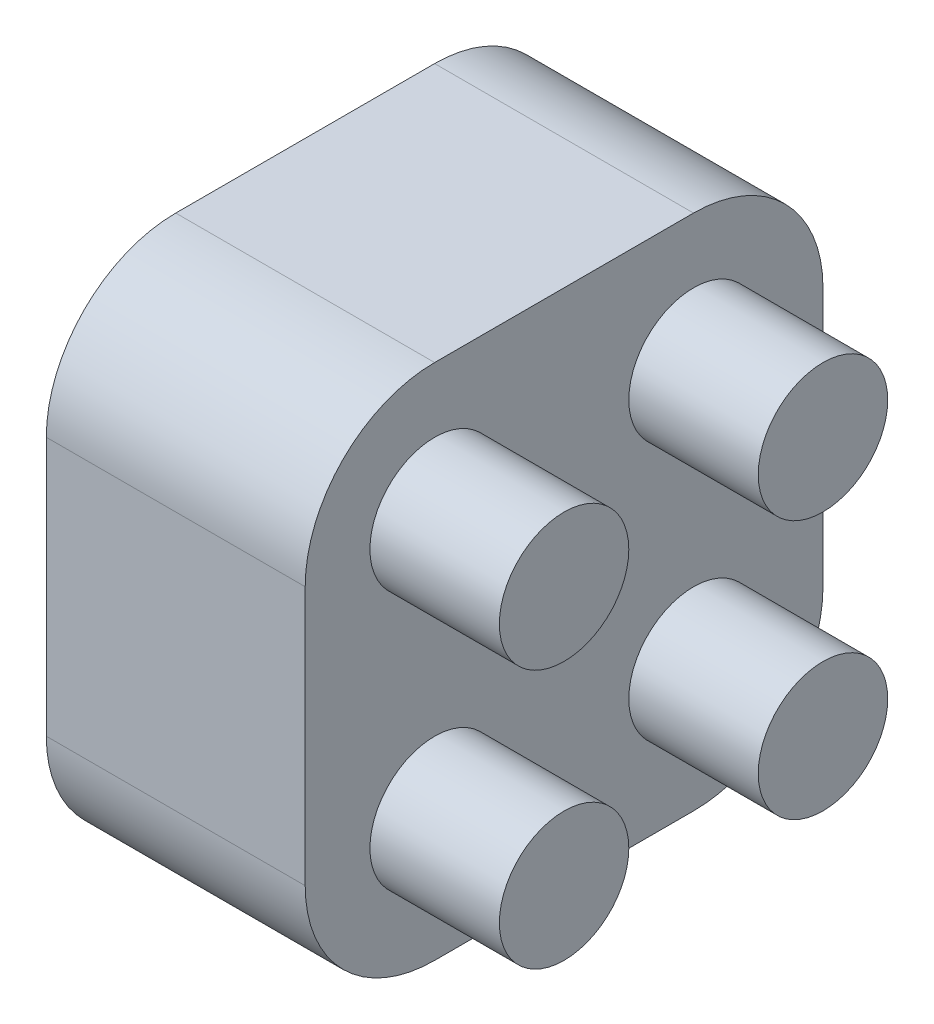
ISO-10303-21;
HEADER;
FILE_DESCRIPTION(('STEP AP214'),'2;1');
FILE_NAME('part.step','',(''),(''),'','','');
FILE_SCHEMA(('AUTOMOTIVE_DESIGN { 1 0 10303 214 1 1 1 1 }'));
ENDSEC;
DATA;
#1=APPLICATION_CONTEXT('core data for automotive mechanical design processes');
#2=APPLICATION_PROTOCOL_DEFINITION('international standard','automotive_design',2000,#1);
#3=PRODUCT_CONTEXT('',#1,'mechanical');
#4=PRODUCT('Part','Part','',(#3));
#5=PRODUCT_RELATED_PRODUCT_CATEGORY('part','',(#4));
#6=PRODUCT_DEFINITION_FORMATION('','',#4);
#7=PRODUCT_DEFINITION_CONTEXT('part definition',#1,'design');
#8=PRODUCT_DEFINITION('design','',#6,#7);
#9=PRODUCT_DEFINITION_SHAPE('','',#8);
#10=(LENGTH_UNIT() NAMED_UNIT(*) SI_UNIT(.MILLI.,.METRE.));
#11=(NAMED_UNIT(*) PLANE_ANGLE_UNIT() SI_UNIT($,.RADIAN.));
#12=(NAMED_UNIT(*) SI_UNIT($,.STERADIAN.) SOLID_ANGLE_UNIT());
#13=UNCERTAINTY_MEASURE_WITH_UNIT(LENGTH_MEASURE(1.E-05),#10,'distance_accuracy_value','');
#14=(GEOMETRIC_REPRESENTATION_CONTEXT(3) GLOBAL_UNCERTAINTY_ASSIGNED_CONTEXT((#13)) GLOBAL_UNIT_ASSIGNED_CONTEXT((#10,
#11,#12)) REPRESENTATION_CONTEXT('',''));
#15=CARTESIAN_POINT('',(0.,0.,0.));
#16=DIRECTION('',(0.,0.,1.));
#17=DIRECTION('',(1.,0.,0.));
#18=AXIS2_PLACEMENT_3D('',#15,#16,#17);
#19=CARTESIAN_POINT('',(0.,0.,0.));
#20=DIRECTION('',(-1.,0.,0.));
#21=DIRECTION('',(0.,0.,1.));
#22=AXIS2_PLACEMENT_3D('',#19,#20,#21);
#23=PLANE('',#22);
#24=DIRECTION('',(0.,1.,0.));
#25=VECTOR('',#24,1.);
#26=CARTESIAN_POINT('',(0.,0.,-20.));
#27=LINE('',#26,#25);
#28=CARTESIAN_POINT('',(0.,5.,-20.));
#29=VERTEX_POINT('',#28);
#30=CARTESIAN_POINT('',(0.,15.,-20.));
#31=VERTEX_POINT('',#30);
#32=EDGE_CURVE('E250',#29,#31,#27,.T.);
#33=ORIENTED_EDGE('',*,*,#32,.F.);
#34=CARTESIAN_POINT('',(0.,5.,-15.));
#35=DIRECTION('',(-1.,0.,0.));
#36=DIRECTION('',(0.,0.,1.));
#37=AXIS2_PLACEMENT_3D('',#34,#35,#36);
#38=CIRCLE('',#37,5.);
#39=CARTESIAN_POINT('',(0.,0.,-15.));
#40=VERTEX_POINT('',#39);
#41=EDGE_CURVE('E276',#29,#40,#38,.T.);
#42=ORIENTED_EDGE('',*,*,#41,.T.);
#43=DIRECTION('',(0.,0.,-1.));
#44=VECTOR('',#43,1.);
#45=CARTESIAN_POINT('',(0.,0.,0.));
#46=LINE('',#45,#44);
#47=CARTESIAN_POINT('',(0.,0.,-5.));
#48=VERTEX_POINT('',#47);
#49=EDGE_CURVE('E247',#48,#40,#46,.T.);
#50=ORIENTED_EDGE('',*,*,#49,.F.);
#51=CARTESIAN_POINT('',(0.,5.,-5.));
#52=DIRECTION('',(-1.,0.,0.));
#53=DIRECTION('',(0.,0.,1.));
#54=AXIS2_PLACEMENT_3D('',#51,#52,#53);
#55=CIRCLE('',#54,5.);
#56=CARTESIAN_POINT('',(0.,5.,0.));
#57=VERTEX_POINT('',#56);
#58=EDGE_CURVE('E274',#48,#57,#55,.T.);
#59=ORIENTED_EDGE('',*,*,#58,.T.);
#60=DIRECTION('',(0.,-1.,0.));
#61=VECTOR('',#60,1.);
#62=CARTESIAN_POINT('',(0.,0.,0.));
#63=LINE('',#62,#61);
#64=CARTESIAN_POINT('',(0.,15.,0.));
#65=VERTEX_POINT('',#64);
#66=EDGE_CURVE('E231',#65,#57,#63,.T.);
#67=ORIENTED_EDGE('',*,*,#66,.F.);
#68=CARTESIAN_POINT('',(0.,15.,-5.));
#69=DIRECTION('',(-1.,0.,0.));
#70=DIRECTION('',(0.,0.,1.));
#71=AXIS2_PLACEMENT_3D('',#68,#69,#70);
#72=CIRCLE('',#71,5.);
#73=CARTESIAN_POINT('',(0.,20.,-5.));
#74=VERTEX_POINT('',#73);
#75=EDGE_CURVE('E272',#65,#74,#72,.T.);
#76=ORIENTED_EDGE('',*,*,#75,.T.);
#77=DIRECTION('',(0.,0.,1.));
#78=VECTOR('',#77,1.);
#79=CARTESIAN_POINT('',(0.,20.,0.));
#80=LINE('',#79,#78);
#81=CARTESIAN_POINT('',(0.,20.,-15.));
#82=VERTEX_POINT('',#81);
#83=EDGE_CURVE('E236',#82,#74,#80,.T.);
#84=ORIENTED_EDGE('',*,*,#83,.F.);
#85=CARTESIAN_POINT('',(0.,15.,-15.));
#86=DIRECTION('',(-1.,0.,0.));
#87=DIRECTION('',(0.,0.,1.));
#88=AXIS2_PLACEMENT_3D('',#85,#86,#87);
#89=CIRCLE('',#88,5.);
#90=EDGE_CURVE('E270',#82,#31,#89,.T.);
#91=ORIENTED_EDGE('',*,*,#90,.T.);
#92=EDGE_LOOP('',(#33,#42,#50,#59,#67,#76,#84,#91));
#93=FACE_BOUND('',#92,.T.);
#94=CARTESIAN_POINT('',(0.,5.,-15.));
#95=DIRECTION('',(-1.,0.,0.));
#96=DIRECTION('',(0.,0.,1.));
#97=AXIS2_PLACEMENT_3D('',#94,#95,#96);
#98=CIRCLE('',#97,3.);
#99=CARTESIAN_POINT('',(0.,5.,-18.));
#100=VERTEX_POINT('',#99);
#101=CARTESIAN_POINT('',(0.,2.,-15.));
#102=VERTEX_POINT('',#101);
#103=EDGE_CURVE('E214',#100,#102,#98,.T.);
#104=ORIENTED_EDGE('',*,*,#103,.F.);
#105=DIRECTION('',(0.,1.,0.));
#106=VECTOR('',#105,1.);
#107=CARTESIAN_POINT('',(0.,0.,-18.));
#108=LINE('',#107,#106);
#109=CARTESIAN_POINT('',(0.,15.,-18.));
#110=VERTEX_POINT('',#109);
#111=EDGE_CURVE('E175',#100,#110,#108,.T.);
#112=ORIENTED_EDGE('',*,*,#111,.T.);
#113=CARTESIAN_POINT('',(0.,15.,-15.));
#114=DIRECTION('',(-1.,0.,0.));
#115=DIRECTION('',(0.,0.,1.));
#116=AXIS2_PLACEMENT_3D('',#113,#114,#115);
#117=CIRCLE('',#116,3.);
#118=CARTESIAN_POINT('',(0.,18.,-15.));
#119=VERTEX_POINT('',#118);
#120=EDGE_CURVE('E177',#119,#110,#117,.T.);
#121=ORIENTED_EDGE('',*,*,#120,.F.);
#122=DIRECTION('',(0.,0.,1.));
#123=VECTOR('',#122,1.);
#124=CARTESIAN_POINT('',(0.,18.,0.));
#125=LINE('',#124,#123);
#126=CARTESIAN_POINT('',(0.,18.,-5.));
#127=VERTEX_POINT('',#126);
#128=EDGE_CURVE('E48',#119,#127,#125,.T.);
#129=ORIENTED_EDGE('',*,*,#128,.T.);
#130=CARTESIAN_POINT('',(0.,15.,-5.));
#131=DIRECTION('',(-1.,0.,0.));
#132=DIRECTION('',(0.,0.,1.));
#133=AXIS2_PLACEMENT_3D('',#130,#131,#132);
#134=CIRCLE('',#133,3.);
#135=CARTESIAN_POINT('',(0.,15.,-2.));
#136=VERTEX_POINT('',#135);
#137=EDGE_CURVE('E180',#136,#127,#134,.T.);
#138=ORIENTED_EDGE('',*,*,#137,.F.);
#139=DIRECTION('',(0.,-1.,0.));
#140=VECTOR('',#139,1.);
#141=CARTESIAN_POINT('',(0.,0.,-2.));
#142=LINE('',#141,#140);
#143=CARTESIAN_POINT('',(0.,5.,-2.));
#144=VERTEX_POINT('',#143);
#145=EDGE_CURVE('E196',#136,#144,#142,.T.);
#146=ORIENTED_EDGE('',*,*,#145,.T.);
#147=CARTESIAN_POINT('',(0.,5.,-5.));
#148=DIRECTION('',(-1.,0.,0.));
#149=DIRECTION('',(0.,0.,1.));
#150=AXIS2_PLACEMENT_3D('',#147,#148,#149);
#151=CIRCLE('',#150,3.);
#152=CARTESIAN_POINT('',(0.,2.,-5.));
#153=VERTEX_POINT('',#152);
#154=EDGE_CURVE('E210',#153,#144,#151,.T.);
#155=ORIENTED_EDGE('',*,*,#154,.F.);
#156=DIRECTION('',(0.,0.,-1.));
#157=VECTOR('',#156,1.);
#158=CARTESIAN_POINT('',(0.,2.,0.));
#159=LINE('',#158,#157);
#160=EDGE_CURVE('E208',#153,#102,#159,.T.);
#161=ORIENTED_EDGE('',*,*,#160,.T.);
#162=EDGE_LOOP('',(#104,#112,#121,#129,#138,#146,#155,#161));
#163=FACE_BOUND('',#162,.T.);
#164=ADVANCED_FACE('F33',(#93,#163),#23,.T.);
#165=CARTESIAN_POINT('',(10.,0.,0.));
#166=DIRECTION('',(-1.,0.,0.));
#167=DIRECTION('',(0.,0.,1.));
#168=AXIS2_PLACEMENT_3D('',#165,#166,#167);
#169=PLANE('',#168);
#170=CARTESIAN_POINT('',(10.,5.,-15.0000000000001));
#171=DIRECTION('',(-1.,0.,0.));
#172=DIRECTION('',(0.,0.,1.));
#173=AXIS2_PLACEMENT_3D('',#170,#171,#172);
#174=CIRCLE('',#173,2.5);
#175=CARTESIAN_POINT('',(10.,5.,-12.5000000000001));
#176=VERTEX_POINT('',#175);
#177=EDGE_CURVE('E259',#176,#176,#174,.F.);
#178=ORIENTED_EDGE('',*,*,#177,.F.);
#179=EDGE_LOOP('',(#178));
#180=FACE_BOUND('',#179,.T.);
#181=CARTESIAN_POINT('',(10.,15.,-5.));
#182=DIRECTION('',(-1.,0.,0.));
#183=DIRECTION('',(0.,0.,1.));
#184=AXIS2_PLACEMENT_3D('',#181,#182,#183);
#185=CIRCLE('',#184,2.5);
#186=CARTESIAN_POINT('',(10.,15.,-2.5));
#187=VERTEX_POINT('',#186);
#188=EDGE_CURVE('E244',#187,#187,#185,.F.);
#189=ORIENTED_EDGE('',*,*,#188,.F.);
#190=EDGE_LOOP('',(#189));
#191=FACE_BOUND('',#190,.T.);
#192=DIRECTION('',(0.,0.,-1.));
#193=VECTOR('',#192,1.);
#194=CARTESIAN_POINT('',(10.,0.,0.));
#195=LINE('',#194,#193);
#196=CARTESIAN_POINT('',(10.,0.,-5.));
#197=VERTEX_POINT('',#196);
#198=CARTESIAN_POINT('',(10.,0.,-15.));
#199=VERTEX_POINT('',#198);
#200=EDGE_CURVE('E235',#197,#199,#195,.T.);
#201=ORIENTED_EDGE('',*,*,#200,.T.);
#202=CARTESIAN_POINT('',(10.,5.,-15.));
#203=DIRECTION('',(-1.,0.,0.));
#204=DIRECTION('',(0.,0.,1.));
#205=AXIS2_PLACEMENT_3D('',#202,#203,#204);
#206=CIRCLE('',#205,5.);
#207=CARTESIAN_POINT('',(10.,5.,-20.));
#208=VERTEX_POINT('',#207);
#209=EDGE_CURVE('E289',#199,#208,#206,.F.);
#210=ORIENTED_EDGE('',*,*,#209,.T.);
#211=DIRECTION('',(0.,1.,0.));
#212=VECTOR('',#211,1.);
#213=CARTESIAN_POINT('',(10.,0.,-20.));
#214=LINE('',#213,#212);
#215=CARTESIAN_POINT('',(10.,15.,-20.));
#216=VERTEX_POINT('',#215);
#217=EDGE_CURVE('E239',#208,#216,#214,.T.);
#218=ORIENTED_EDGE('',*,*,#217,.T.);
#219=CARTESIAN_POINT('',(10.,15.,-15.));
#220=DIRECTION('',(-1.,0.,0.));
#221=DIRECTION('',(0.,0.,1.));
#222=AXIS2_PLACEMENT_3D('',#219,#220,#221);
#223=CIRCLE('',#222,5.);
#224=CARTESIAN_POINT('',(10.,20.,-15.));
#225=VERTEX_POINT('',#224);
#226=EDGE_CURVE('E283',#216,#225,#223,.F.);
#227=ORIENTED_EDGE('',*,*,#226,.T.);
#228=DIRECTION('',(0.,0.,1.));
#229=VECTOR('',#228,1.);
#230=CARTESIAN_POINT('',(10.,20.,0.));
#231=LINE('',#230,#229);
#232=CARTESIAN_POINT('',(10.,20.,-5.));
#233=VERTEX_POINT('',#232);
#234=EDGE_CURVE('E242',#225,#233,#231,.T.);
#235=ORIENTED_EDGE('',*,*,#234,.T.);
#236=CARTESIAN_POINT('',(10.,15.,-5.));
#237=DIRECTION('',(-1.,0.,0.));
#238=DIRECTION('',(0.,0.,1.));
#239=AXIS2_PLACEMENT_3D('',#236,#237,#238);
#240=CIRCLE('',#239,5.);
#241=CARTESIAN_POINT('',(10.,15.,0.));
#242=VERTEX_POINT('',#241);
#243=EDGE_CURVE('E285',#233,#242,#240,.F.);
#244=ORIENTED_EDGE('',*,*,#243,.T.);
#245=DIRECTION('',(0.,-1.,0.));
#246=VECTOR('',#245,1.);
#247=CARTESIAN_POINT('',(10.,0.,0.));
#248=LINE('',#247,#246);
#249=CARTESIAN_POINT('',(10.,5.,0.));
#250=VERTEX_POINT('',#249);
#251=EDGE_CURVE('E232',#242,#250,#248,.T.);
#252=ORIENTED_EDGE('',*,*,#251,.T.);
#253=CARTESIAN_POINT('',(10.,5.,-5.));
#254=DIRECTION('',(-1.,0.,0.));
#255=DIRECTION('',(0.,0.,1.));
#256=AXIS2_PLACEMENT_3D('',#253,#254,#255);
#257=CIRCLE('',#256,5.);
#258=EDGE_CURVE('E287',#250,#197,#257,.F.);
#259=ORIENTED_EDGE('',*,*,#258,.T.);
#260=EDGE_LOOP('',(#201,#210,#218,#227,#235,#244,#252,#259));
#261=FACE_BOUND('',#260,.T.);
#262=CARTESIAN_POINT('',(10.,15.,-15.));
#263=DIRECTION('',(-1.,0.,0.));
#264=DIRECTION('',(0.,0.,1.));
#265=AXIS2_PLACEMENT_3D('',#262,#263,#264);
#266=CIRCLE('',#265,2.5);
#267=CARTESIAN_POINT('',(10.,15.,-12.5));
#268=VERTEX_POINT('',#267);
#269=EDGE_CURVE('E256',#268,#268,#266,.F.);
#270=ORIENTED_EDGE('',*,*,#269,.F.);
#271=EDGE_LOOP('',(#270));
#272=FACE_BOUND('',#271,.T.);
#273=CARTESIAN_POINT('',(10.,5.,-5.0000000000001));
#274=DIRECTION('',(-1.,0.,0.));
#275=DIRECTION('',(0.,0.,1.));
#276=AXIS2_PLACEMENT_3D('',#273,#274,#275);
#277=CIRCLE('',#276,2.5);
#278=CARTESIAN_POINT('',(10.,5.,-2.50000000000011));
#279=VERTEX_POINT('',#278);
#280=EDGE_CURVE('E262',#279,#279,#277,.F.);
#281=ORIENTED_EDGE('',*,*,#280,.F.);
#282=EDGE_LOOP('',(#281));
#283=FACE_BOUND('',#282,.T.);
#284=ADVANCED_FACE('F315',(#180,#191,#261,#272,#283),#169,.F.);
#285=CARTESIAN_POINT('',(10.,0.,0.));
#286=DIRECTION('',(0.,0.,-1.));
#287=DIRECTION('',(-1.,0.,0.));
#288=AXIS2_PLACEMENT_3D('',#285,#286,#287);
#289=PLANE('',#288);
#290=ORIENTED_EDGE('',*,*,#66,.T.);
#291=DIRECTION('',(-1.,0.,0.));
#292=VECTOR('',#291,1.);
#293=CARTESIAN_POINT('',(10.,5.,0.));
#294=LINE('',#293,#292);
#295=EDGE_CURVE('E294',#57,#250,#294,.F.);
#296=ORIENTED_EDGE('',*,*,#295,.T.);
#297=ORIENTED_EDGE('',*,*,#251,.F.);
#298=DIRECTION('',(-1.,0.,0.));
#299=VECTOR('',#298,1.);
#300=CARTESIAN_POINT('',(10.,15.,0.));
#301=LINE('',#300,#299);
#302=EDGE_CURVE('E291',#242,#65,#301,.T.);
#303=ORIENTED_EDGE('',*,*,#302,.T.);
#304=EDGE_LOOP('',(#290,#296,#297,#303));
#305=FACE_BOUND('',#304,.T.);
#306=ADVANCED_FACE('F311',(#305),#289,.F.);
#307=CARTESIAN_POINT('',(10.,0.,0.));
#308=DIRECTION('',(0.,1.,0.));
#309=DIRECTION('',(0.,0.,1.));
#310=AXIS2_PLACEMENT_3D('',#307,#308,#309);
#311=PLANE('',#310);
#312=ORIENTED_EDGE('',*,*,#49,.T.);
#313=DIRECTION('',(-1.,0.,0.));
#314=VECTOR('',#313,1.);
#315=CARTESIAN_POINT('',(10.,0.,-15.));
#316=LINE('',#315,#314);
#317=EDGE_CURVE('E281',#40,#199,#316,.F.);
#318=ORIENTED_EDGE('',*,*,#317,.T.);
#319=ORIENTED_EDGE('',*,*,#200,.F.);
#320=DIRECTION('',(-1.,0.,0.));
#321=VECTOR('',#320,1.);
#322=CARTESIAN_POINT('',(10.,0.,-5.));
#323=LINE('',#322,#321);
#324=EDGE_CURVE('E278',#197,#48,#323,.T.);
#325=ORIENTED_EDGE('',*,*,#324,.T.);
#326=EDGE_LOOP('',(#312,#318,#319,#325));
#327=FACE_BOUND('',#326,.T.);
#328=ADVANCED_FACE('F323',(#327),#311,.F.);
#329=CARTESIAN_POINT('',(10.,0.,-20.));
#330=DIRECTION('',(0.,0.,1.));
#331=DIRECTION('',(1.,0.,0.));
#332=AXIS2_PLACEMENT_3D('',#329,#330,#331);
#333=PLANE('',#332);
#334=ORIENTED_EDGE('',*,*,#217,.F.);
#335=DIRECTION('',(-1.,0.,0.));
#336=VECTOR('',#335,1.);
#337=CARTESIAN_POINT('',(10.,5.,-20.));
#338=LINE('',#337,#336);
#339=EDGE_CURVE('E267',#208,#29,#338,.T.);
#340=ORIENTED_EDGE('',*,*,#339,.T.);
#341=ORIENTED_EDGE('',*,*,#32,.T.);
#342=DIRECTION('',(-1.,0.,0.));
#343=VECTOR('',#342,1.);
#344=CARTESIAN_POINT('',(10.,15.,-20.));
#345=LINE('',#344,#343);
#346=EDGE_CURVE('E265',#31,#216,#345,.F.);
#347=ORIENTED_EDGE('',*,*,#346,.T.);
#348=EDGE_LOOP('',(#334,#340,#341,#347));
#349=FACE_BOUND('',#348,.T.);
#350=ADVANCED_FACE('F331',(#349),#333,.F.);
#351=CARTESIAN_POINT('',(10.,20.,0.));
#352=DIRECTION('',(0.,-1.,0.));
#353=DIRECTION('',(0.,0.,-1.));
#354=AXIS2_PLACEMENT_3D('',#351,#352,#353);
#355=PLANE('',#354);
#356=ORIENTED_EDGE('',*,*,#83,.T.);
#357=DIRECTION('',(-1.,0.,0.));
#358=VECTOR('',#357,1.);
#359=CARTESIAN_POINT('',(10.,20.,-5.));
#360=LINE('',#359,#358);
#361=EDGE_CURVE('E11',#74,#233,#360,.F.);
#362=ORIENTED_EDGE('',*,*,#361,.T.);
#363=ORIENTED_EDGE('',*,*,#234,.F.);
#364=DIRECTION('',(-1.,0.,0.));
#365=VECTOR('',#364,1.);
#366=CARTESIAN_POINT('',(10.,20.,-15.));
#367=LINE('',#366,#365);
#368=EDGE_CURVE('E41',#225,#82,#367,.T.);
#369=ORIENTED_EDGE('',*,*,#368,.T.);
#370=EDGE_LOOP('',(#356,#362,#363,#369));
#371=FACE_BOUND('',#370,.T.);
#372=ADVANCED_FACE('F298',(#371),#355,.F.);
#373=CARTESIAN_POINT('',(15.,15.,-5.));
#374=DIRECTION('',(-1.,0.,0.));
#375=DIRECTION('',(0.,0.,1.));
#376=AXIS2_PLACEMENT_3D('',#373,#374,#375);
#377=CYLINDRICAL_SURFACE('',#376,2.5);
#378=CARTESIAN_POINT('',(15.,15.,-5.));
#379=DIRECTION('',(1.,0.,0.));
#380=DIRECTION('',(0.,0.,-1.));
#381=AXIS2_PLACEMENT_3D('',#378,#379,#380);
#382=CIRCLE('',#381,2.5);
#383=CARTESIAN_POINT('',(15.,15.,-7.5));
#384=VERTEX_POINT('',#383);
#385=EDGE_CURVE('E228',#384,#384,#382,.T.);
#386=ORIENTED_EDGE('',*,*,#385,.F.);
#387=EDGE_LOOP('',(#386));
#388=FACE_BOUND('',#387,.T.);
#389=ORIENTED_EDGE('',*,*,#188,.T.);
#390=EDGE_LOOP('',(#389));
#391=FACE_BOUND('',#390,.T.);
#392=ADVANCED_FACE('F352',(#388,#391),#377,.T.);
#393=CARTESIAN_POINT('',(15.,15.,-5.));
#394=DIRECTION('',(1.,0.,0.));
#395=DIRECTION('',(0.,0.,-1.));
#396=AXIS2_PLACEMENT_3D('',#393,#394,#395);
#397=PLANE('',#396);
#398=ORIENTED_EDGE('',*,*,#385,.T.);
#399=EDGE_LOOP('',(#398));
#400=FACE_BOUND('',#399,.T.);
#401=ADVANCED_FACE('F566',(#400),#397,.T.);
#402=CARTESIAN_POINT('',(15.,15.,-15.));
#403=DIRECTION('',(-1.,0.,0.));
#404=DIRECTION('',(0.,0.,1.));
#405=AXIS2_PLACEMENT_3D('',#402,#403,#404);
#406=CYLINDRICAL_SURFACE('',#405,2.5);
#407=CARTESIAN_POINT('',(15.,15.,-15.));
#408=DIRECTION('',(1.,0.,0.));
#409=DIRECTION('',(0.,0.,-1.));
#410=AXIS2_PLACEMENT_3D('',#407,#408,#409);
#411=CIRCLE('',#410,2.5);
#412=CARTESIAN_POINT('',(15.,15.,-17.5));
#413=VERTEX_POINT('',#412);
#414=EDGE_CURVE('E225',#413,#413,#411,.T.);
#415=ORIENTED_EDGE('',*,*,#414,.F.);
#416=EDGE_LOOP('',(#415));
#417=FACE_BOUND('',#416,.T.);
#418=ORIENTED_EDGE('',*,*,#269,.T.);
#419=EDGE_LOOP('',(#418));
#420=FACE_BOUND('',#419,.T.);
#421=ADVANCED_FACE('F562',(#417,#420),#406,.T.);
#422=CARTESIAN_POINT('',(15.,15.,-15.));
#423=DIRECTION('',(1.,0.,0.));
#424=DIRECTION('',(0.,0.,-1.));
#425=AXIS2_PLACEMENT_3D('',#422,#423,#424);
#426=PLANE('',#425);
#427=ORIENTED_EDGE('',*,*,#414,.T.);
#428=EDGE_LOOP('',(#427));
#429=FACE_BOUND('',#428,.T.);
#430=ADVANCED_FACE('F558',(#429),#426,.T.);
#431=CARTESIAN_POINT('',(15.,5.,-15.0000000000001));
#432=DIRECTION('',(-1.,0.,0.));
#433=DIRECTION('',(0.,0.,1.));
#434=AXIS2_PLACEMENT_3D('',#431,#432,#433);
#435=CYLINDRICAL_SURFACE('',#434,2.5);
#436=CARTESIAN_POINT('',(15.,5.,-15.0000000000001));
#437=DIRECTION('',(1.,0.,0.));
#438=DIRECTION('',(0.,0.,-1.));
#439=AXIS2_PLACEMENT_3D('',#436,#437,#438);
#440=CIRCLE('',#439,2.5);
#441=CARTESIAN_POINT('',(15.,5.,-17.5000000000001));
#442=VERTEX_POINT('',#441);
#443=EDGE_CURVE('E222',#442,#442,#440,.T.);
#444=ORIENTED_EDGE('',*,*,#443,.F.);
#445=EDGE_LOOP('',(#444));
#446=FACE_BOUND('',#445,.T.);
#447=ORIENTED_EDGE('',*,*,#177,.T.);
#448=EDGE_LOOP('',(#447));
#449=FACE_BOUND('',#448,.T.);
#450=ADVANCED_FACE('F554',(#446,#449),#435,.T.);
#451=CARTESIAN_POINT('',(15.,5.,-15.0000000000001));
#452=DIRECTION('',(1.,0.,0.));
#453=DIRECTION('',(0.,0.,-1.));
#454=AXIS2_PLACEMENT_3D('',#451,#452,#453);
#455=PLANE('',#454);
#456=ORIENTED_EDGE('',*,*,#443,.T.);
#457=EDGE_LOOP('',(#456));
#458=FACE_BOUND('',#457,.T.);
#459=ADVANCED_FACE('F550',(#458),#455,.T.);
#460=CARTESIAN_POINT('',(15.,5.,-5.0000000000001));
#461=DIRECTION('',(-1.,0.,0.));
#462=DIRECTION('',(0.,0.,1.));
#463=AXIS2_PLACEMENT_3D('',#460,#461,#462);
#464=CYLINDRICAL_SURFACE('',#463,2.5);
#465=CARTESIAN_POINT('',(15.,5.,-5.0000000000001));
#466=DIRECTION('',(1.,0.,0.));
#467=DIRECTION('',(0.,0.,-1.));
#468=AXIS2_PLACEMENT_3D('',#465,#466,#467);
#469=CIRCLE('',#468,2.5);
#470=CARTESIAN_POINT('',(15.,5.,-7.5000000000001));
#471=VERTEX_POINT('',#470);
#472=EDGE_CURVE('E192',#471,#471,#469,.T.);
#473=ORIENTED_EDGE('',*,*,#472,.F.);
#474=EDGE_LOOP('',(#473));
#475=FACE_BOUND('',#474,.T.);
#476=ORIENTED_EDGE('',*,*,#280,.T.);
#477=EDGE_LOOP('',(#476));
#478=FACE_BOUND('',#477,.T.);
#479=ADVANCED_FACE('F546',(#475,#478),#464,.T.);
#480=CARTESIAN_POINT('',(15.,5.,-5.0000000000001));
#481=DIRECTION('',(1.,0.,0.));
#482=DIRECTION('',(0.,0.,-1.));
#483=AXIS2_PLACEMENT_3D('',#480,#481,#482);
#484=PLANE('',#483);
#485=ORIENTED_EDGE('',*,*,#472,.T.);
#486=EDGE_LOOP('',(#485));
#487=FACE_BOUND('',#486,.T.);
#488=ADVANCED_FACE('F361',(#487),#484,.T.);
#489=CARTESIAN_POINT('',(10.,5.,-15.));
#490=DIRECTION('',(-1.,0.,0.));
#491=DIRECTION('',(0.,0.,1.));
#492=AXIS2_PLACEMENT_3D('',#489,#490,#491);
#493=CYLINDRICAL_SURFACE('',#492,5.);
#494=ORIENTED_EDGE('',*,*,#209,.F.);
#495=ORIENTED_EDGE('',*,*,#317,.F.);
#496=ORIENTED_EDGE('',*,*,#41,.F.);
#497=ORIENTED_EDGE('',*,*,#339,.F.);
#498=EDGE_LOOP('',(#494,#495,#496,#497));
#499=FACE_BOUND('',#498,.T.);
#500=ADVANCED_FACE('F328',(#499),#493,.T.);
#501=CARTESIAN_POINT('',(10.,5.,-5.));
#502=DIRECTION('',(-1.,0.,0.));
#503=DIRECTION('',(0.,0.,1.));
#504=AXIS2_PLACEMENT_3D('',#501,#502,#503);
#505=CYLINDRICAL_SURFACE('',#504,5.);
#506=ORIENTED_EDGE('',*,*,#258,.F.);
#507=ORIENTED_EDGE('',*,*,#295,.F.);
#508=ORIENTED_EDGE('',*,*,#58,.F.);
#509=ORIENTED_EDGE('',*,*,#324,.F.);
#510=EDGE_LOOP('',(#506,#507,#508,#509));
#511=FACE_BOUND('',#510,.T.);
#512=ADVANCED_FACE('F320',(#511),#505,.T.);
#513=CARTESIAN_POINT('',(10.,15.,-5.));
#514=DIRECTION('',(-1.,0.,0.));
#515=DIRECTION('',(0.,0.,1.));
#516=AXIS2_PLACEMENT_3D('',#513,#514,#515);
#517=CYLINDRICAL_SURFACE('',#516,5.);
#518=ORIENTED_EDGE('',*,*,#243,.F.);
#519=ORIENTED_EDGE('',*,*,#361,.F.);
#520=ORIENTED_EDGE('',*,*,#75,.F.);
#521=ORIENTED_EDGE('',*,*,#302,.F.);
#522=EDGE_LOOP('',(#518,#519,#520,#521));
#523=FACE_BOUND('',#522,.T.);
#524=ADVANCED_FACE('F308',(#523),#517,.T.);
#525=CARTESIAN_POINT('',(10.,15.,-15.));
#526=DIRECTION('',(-1.,0.,0.));
#527=DIRECTION('',(0.,0.,1.));
#528=AXIS2_PLACEMENT_3D('',#525,#526,#527);
#529=CYLINDRICAL_SURFACE('',#528,5.);
#530=ORIENTED_EDGE('',*,*,#226,.F.);
#531=ORIENTED_EDGE('',*,*,#346,.F.);
#532=ORIENTED_EDGE('',*,*,#90,.F.);
#533=ORIENTED_EDGE('',*,*,#368,.F.);
#534=EDGE_LOOP('',(#530,#531,#532,#533));
#535=FACE_BOUND('',#534,.T.);
#536=ADVANCED_FACE('F35',(#535),#529,.T.);
#537=CARTESIAN_POINT('',(8.,0.,0.));
#538=DIRECTION('',(-1.,0.,0.));
#539=DIRECTION('',(0.,0.,1.));
#540=AXIS2_PLACEMENT_3D('',#537,#538,#539);
#541=PLANE('',#540);
#542=CARTESIAN_POINT('',(8.,5.,-15.0000000000001));
#543=DIRECTION('',(-1.,0.,0.));
#544=DIRECTION('',(0.,0.,1.));
#545=AXIS2_PLACEMENT_3D('',#542,#543,#544);
#546=CIRCLE('',#545,0.500000000000002);
#547=CARTESIAN_POINT('',(8.,5.,-14.5000000000001));
#548=VERTEX_POINT('',#547);
#549=EDGE_CURVE('E688',#548,#548,#546,.F.);
#550=ORIENTED_EDGE('',*,*,#549,.T.);
#551=EDGE_LOOP('',(#550));
#552=FACE_BOUND('',#551,.T.);
#553=CARTESIAN_POINT('',(8.,15.,-5.));
#554=DIRECTION('',(-1.,0.,0.));
#555=DIRECTION('',(0.,0.,1.));
#556=AXIS2_PLACEMENT_3D('',#553,#554,#555);
#557=CIRCLE('',#556,0.499999999999999);
#558=CARTESIAN_POINT('',(8.,15.,-4.5));
#559=VERTEX_POINT('',#558);
#560=EDGE_CURVE('E676',#559,#559,#557,.F.);
#561=ORIENTED_EDGE('',*,*,#560,.T.);
#562=EDGE_LOOP('',(#561));
#563=FACE_BOUND('',#562,.T.);
#564=DIRECTION('',(0.,0.,-1.));
#565=VECTOR('',#564,1.);
#566=CARTESIAN_POINT('',(8.,2.,0.));
#567=LINE('',#566,#565);
#568=CARTESIAN_POINT('',(8.,2.,-5.));
#569=VERTEX_POINT('',#568);
#570=CARTESIAN_POINT('',(8.,2.,-15.));
#571=VERTEX_POINT('',#570);
#572=EDGE_CURVE('E171',#569,#571,#567,.T.);
#573=ORIENTED_EDGE('',*,*,#572,.F.);
#574=CARTESIAN_POINT('',(8.,5.,-5.));
#575=DIRECTION('',(-1.,0.,0.));
#576=DIRECTION('',(0.,0.,1.));
#577=AXIS2_PLACEMENT_3D('',#574,#575,#576);
#578=CIRCLE('',#577,3.);
#579=CARTESIAN_POINT('',(8.,5.,-2.));
#580=VERTEX_POINT('',#579);
#581=EDGE_CURVE('E159',#580,#569,#578,.F.);
#582=ORIENTED_EDGE('',*,*,#581,.F.);
#583=DIRECTION('',(0.,-1.,0.));
#584=VECTOR('',#583,1.);
#585=CARTESIAN_POINT('',(8.,0.,-2.));
#586=LINE('',#585,#584);
#587=CARTESIAN_POINT('',(8.,15.,-2.));
#588=VERTEX_POINT('',#587);
#589=EDGE_CURVE('E211',#588,#580,#586,.T.);
#590=ORIENTED_EDGE('',*,*,#589,.F.);
#591=CARTESIAN_POINT('',(8.,15.,-5.));
#592=DIRECTION('',(-1.,0.,0.));
#593=DIRECTION('',(0.,0.,1.));
#594=AXIS2_PLACEMENT_3D('',#591,#592,#593);
#595=CIRCLE('',#594,3.);
#596=CARTESIAN_POINT('',(8.,18.,-5.));
#597=VERTEX_POINT('',#596);
#598=EDGE_CURVE('E671',#597,#588,#595,.F.);
#599=ORIENTED_EDGE('',*,*,#598,.F.);
#600=DIRECTION('',(0.,0.,1.));
#601=VECTOR('',#600,1.);
#602=CARTESIAN_POINT('',(8.,18.,0.));
#603=LINE('',#602,#601);
#604=CARTESIAN_POINT('',(8.,18.,-15.));
#605=VERTEX_POINT('',#604);
#606=EDGE_CURVE('E170',#605,#597,#603,.T.);
#607=ORIENTED_EDGE('',*,*,#606,.F.);
#608=CARTESIAN_POINT('',(8.,15.,-15.));
#609=DIRECTION('',(-1.,0.,0.));
#610=DIRECTION('',(0.,0.,1.));
#611=AXIS2_PLACEMENT_3D('',#608,#609,#610);
#612=CIRCLE('',#611,3.);
#613=CARTESIAN_POINT('',(8.,15.,-18.));
#614=VERTEX_POINT('',#613);
#615=EDGE_CURVE('E167',#614,#605,#612,.F.);
#616=ORIENTED_EDGE('',*,*,#615,.F.);
#617=DIRECTION('',(0.,1.,0.));
#618=VECTOR('',#617,1.);
#619=CARTESIAN_POINT('',(8.,0.,-18.));
#620=LINE('',#619,#618);
#621=CARTESIAN_POINT('',(8.,5.,-18.));
#622=VERTEX_POINT('',#621);
#623=EDGE_CURVE('E163',#622,#614,#620,.T.);
#624=ORIENTED_EDGE('',*,*,#623,.F.);
#625=CARTESIAN_POINT('',(8.,5.,-15.));
#626=DIRECTION('',(-1.,0.,0.));
#627=DIRECTION('',(0.,0.,1.));
#628=AXIS2_PLACEMENT_3D('',#625,#626,#627);
#629=CIRCLE('',#628,3.);
#630=EDGE_CURVE('E147',#571,#622,#629,.F.);
#631=ORIENTED_EDGE('',*,*,#630,.F.);
#632=EDGE_LOOP('',(#573,#582,#590,#599,#607,#616,#624,#631));
#633=FACE_BOUND('',#632,.T.);
#634=CARTESIAN_POINT('',(8.,15.,-15.));
#635=DIRECTION('',(-1.,0.,0.));
#636=DIRECTION('',(0.,0.,1.));
#637=AXIS2_PLACEMENT_3D('',#634,#635,#636);
#638=CIRCLE('',#637,0.500000000000002);
#639=CARTESIAN_POINT('',(8.,15.,-14.5));
#640=VERTEX_POINT('',#639);
#641=EDGE_CURVE('E679',#640,#640,#638,.F.);
#642=ORIENTED_EDGE('',*,*,#641,.T.);
#643=EDGE_LOOP('',(#642));
#644=FACE_BOUND('',#643,.T.);
#645=CARTESIAN_POINT('',(8.,5.,-5.0000000000001));
#646=DIRECTION('',(-1.,0.,0.));
#647=DIRECTION('',(0.,0.,1.));
#648=AXIS2_PLACEMENT_3D('',#645,#646,#647);
#649=CIRCLE('',#648,0.499999999999999);
#650=CARTESIAN_POINT('',(8.,5.,-4.50000000000011));
#651=VERTEX_POINT('',#650);
#652=EDGE_CURVE('E182',#651,#651,#649,.F.);
#653=ORIENTED_EDGE('',*,*,#652,.T.);
#654=EDGE_LOOP('',(#653));
#655=FACE_BOUND('',#654,.T.);
#656=ADVANCED_FACE('F164',(#552,#563,#633,#644,#655),#541,.T.);
#657=CARTESIAN_POINT('',(10.,0.,-2.));
#658=DIRECTION('',(0.,0.,-1.));
#659=DIRECTION('',(-1.,0.,0.));
#660=AXIS2_PLACEMENT_3D('',#657,#658,#659);
#661=PLANE('',#660);
#662=ORIENTED_EDGE('',*,*,#145,.F.);
#663=DIRECTION('',(-1.,0.,0.));
#664=VECTOR('',#663,1.);
#665=CARTESIAN_POINT('',(10.,15.,-2.));
#666=LINE('',#665,#664);
#667=EDGE_CURVE('E158',#588,#136,#666,.T.);
#668=ORIENTED_EDGE('',*,*,#667,.F.);
#669=ORIENTED_EDGE('',*,*,#589,.T.);
#670=DIRECTION('',(-1.,0.,0.));
#671=VECTOR('',#670,1.);
#672=CARTESIAN_POINT('',(10.,5.,-2.));
#673=LINE('',#672,#671);
#674=EDGE_CURVE('E190',#144,#580,#673,.F.);
#675=ORIENTED_EDGE('',*,*,#674,.F.);
#676=EDGE_LOOP('',(#662,#668,#669,#675));
#677=FACE_BOUND('',#676,.T.);
#678=ADVANCED_FACE('F338',(#677),#661,.T.);
#679=CARTESIAN_POINT('',(10.,2.,0.));
#680=DIRECTION('',(0.,1.,0.));
#681=DIRECTION('',(0.,0.,1.));
#682=AXIS2_PLACEMENT_3D('',#679,#680,#681);
#683=PLANE('',#682);
#684=ORIENTED_EDGE('',*,*,#160,.F.);
#685=DIRECTION('',(1.,0.,0.));
#686=VECTOR('',#685,1.);
#687=CARTESIAN_POINT('',(10.,2.,-5.));
#688=LINE('',#687,#686);
#689=EDGE_CURVE('E216',#569,#153,#688,.F.);
#690=ORIENTED_EDGE('',*,*,#689,.F.);
#691=ORIENTED_EDGE('',*,*,#572,.T.);
#692=DIRECTION('',(1.,0.,0.));
#693=VECTOR('',#692,1.);
#694=CARTESIAN_POINT('',(10.,2.,-15.));
#695=LINE('',#694,#693);
#696=EDGE_CURVE('E154',#102,#571,#695,.T.);
#697=ORIENTED_EDGE('',*,*,#696,.F.);
#698=EDGE_LOOP('',(#684,#690,#691,#697));
#699=FACE_BOUND('',#698,.T.);
#700=ADVANCED_FACE('F395',(#699),#683,.T.);
#701=CARTESIAN_POINT('',(10.,0.,-18.));
#702=DIRECTION('',(0.,0.,1.));
#703=DIRECTION('',(1.,0.,0.));
#704=AXIS2_PLACEMENT_3D('',#701,#702,#703);
#705=PLANE('',#704);
#706=ORIENTED_EDGE('',*,*,#623,.T.);
#707=DIRECTION('',(1.,0.,0.));
#708=VECTOR('',#707,1.);
#709=CARTESIAN_POINT('',(10.,15.,-18.));
#710=LINE('',#709,#708);
#711=EDGE_CURVE('E178',#110,#614,#710,.T.);
#712=ORIENTED_EDGE('',*,*,#711,.F.);
#713=ORIENTED_EDGE('',*,*,#111,.F.);
#714=DIRECTION('',(1.,0.,0.));
#715=VECTOR('',#714,1.);
#716=CARTESIAN_POINT('',(10.,5.,-18.));
#717=LINE('',#716,#715);
#718=EDGE_CURVE('E151',#622,#100,#717,.F.);
#719=ORIENTED_EDGE('',*,*,#718,.F.);
#720=EDGE_LOOP('',(#706,#712,#713,#719));
#721=FACE_BOUND('',#720,.T.);
#722=ADVANCED_FACE('F173',(#721),#705,.T.);
#723=CARTESIAN_POINT('',(10.,18.,0.));
#724=DIRECTION('',(0.,-1.,0.));
#725=DIRECTION('',(0.,0.,-1.));
#726=AXIS2_PLACEMENT_3D('',#723,#724,#725);
#727=PLANE('',#726);
#728=ORIENTED_EDGE('',*,*,#128,.F.);
#729=DIRECTION('',(1.,0.,0.));
#730=VECTOR('',#729,1.);
#731=CARTESIAN_POINT('',(10.,18.,-15.));
#732=LINE('',#731,#730);
#733=EDGE_CURVE('E187',#605,#119,#732,.F.);
#734=ORIENTED_EDGE('',*,*,#733,.F.);
#735=ORIENTED_EDGE('',*,*,#606,.T.);
#736=DIRECTION('',(1.,0.,0.));
#737=VECTOR('',#736,1.);
#738=CARTESIAN_POINT('',(10.,18.,-5.));
#739=LINE('',#738,#737);
#740=EDGE_CURVE('E189',#127,#597,#739,.T.);
#741=ORIENTED_EDGE('',*,*,#740,.F.);
#742=EDGE_LOOP('',(#728,#734,#735,#741));
#743=FACE_BOUND('',#742,.T.);
#744=ADVANCED_FACE('F414',(#743),#727,.T.);
#745=CARTESIAN_POINT('',(15.,15.,-5.));
#746=DIRECTION('',(-1.,0.,0.));
#747=DIRECTION('',(0.,0.,1.));
#748=AXIS2_PLACEMENT_3D('',#745,#746,#747);
#749=CYLINDRICAL_SURFACE('',#748,0.499999999999999);
#750=CARTESIAN_POINT('',(13.,15.,-5.));
#751=DIRECTION('',(1.,0.,0.));
#752=DIRECTION('',(0.,0.,-1.));
#753=AXIS2_PLACEMENT_3D('',#750,#751,#752);
#754=CIRCLE('',#753,0.499999999999999);
#755=CARTESIAN_POINT('',(13.,15.,-5.5));
#756=VERTEX_POINT('',#755);
#757=EDGE_CURVE('E193',#756,#756,#754,.T.);
#758=ORIENTED_EDGE('',*,*,#757,.T.);
#759=EDGE_LOOP('',(#758));
#760=FACE_BOUND('',#759,.T.);
#761=ORIENTED_EDGE('',*,*,#560,.F.);
#762=EDGE_LOOP('',(#761));
#763=FACE_BOUND('',#762,.T.);
#764=ADVANCED_FACE('F423',(#760,#763),#749,.F.);
#765=CARTESIAN_POINT('',(13.,15.,-5.));
#766=DIRECTION('',(1.,0.,0.));
#767=DIRECTION('',(0.,0.,-1.));
#768=AXIS2_PLACEMENT_3D('',#765,#766,#767);
#769=PLANE('',#768);
#770=ORIENTED_EDGE('',*,*,#757,.F.);
#771=EDGE_LOOP('',(#770));
#772=FACE_BOUND('',#771,.T.);
#773=ADVANCED_FACE('F432',(#772),#769,.F.);
#774=CARTESIAN_POINT('',(15.,15.,-15.));
#775=DIRECTION('',(-1.,0.,0.));
#776=DIRECTION('',(0.,0.,1.));
#777=AXIS2_PLACEMENT_3D('',#774,#775,#776);
#778=CYLINDRICAL_SURFACE('',#777,0.500000000000002);
#779=CARTESIAN_POINT('',(13.,15.,-15.));
#780=DIRECTION('',(1.,0.,0.));
#781=DIRECTION('',(0.,0.,-1.));
#782=AXIS2_PLACEMENT_3D('',#779,#780,#781);
#783=CIRCLE('',#782,0.500000000000002);
#784=CARTESIAN_POINT('',(13.,15.,-15.5));
#785=VERTEX_POINT('',#784);
#786=EDGE_CURVE('E197',#785,#785,#783,.T.);
#787=ORIENTED_EDGE('',*,*,#786,.T.);
#788=EDGE_LOOP('',(#787));
#789=FACE_BOUND('',#788,.T.);
#790=ORIENTED_EDGE('',*,*,#641,.F.);
#791=EDGE_LOOP('',(#790));
#792=FACE_BOUND('',#791,.T.);
#793=ADVANCED_FACE('F442',(#789,#792),#778,.F.);
#794=CARTESIAN_POINT('',(13.,15.,-15.));
#795=DIRECTION('',(1.,0.,0.));
#796=DIRECTION('',(0.,0.,-1.));
#797=AXIS2_PLACEMENT_3D('',#794,#795,#796);
#798=PLANE('',#797);
#799=ORIENTED_EDGE('',*,*,#786,.F.);
#800=EDGE_LOOP('',(#799));
#801=FACE_BOUND('',#800,.T.);
#802=ADVANCED_FACE('F452',(#801),#798,.F.);
#803=CARTESIAN_POINT('',(15.,5.,-15.0000000000001));
#804=DIRECTION('',(-1.,0.,0.));
#805=DIRECTION('',(0.,0.,1.));
#806=AXIS2_PLACEMENT_3D('',#803,#804,#805);
#807=CYLINDRICAL_SURFACE('',#806,0.500000000000002);
#808=CARTESIAN_POINT('',(13.,5.,-15.0000000000001));
#809=DIRECTION('',(1.,0.,0.));
#810=DIRECTION('',(0.,0.,-1.));
#811=AXIS2_PLACEMENT_3D('',#808,#809,#810);
#812=CIRCLE('',#811,0.500000000000002);
#813=CARTESIAN_POINT('',(13.,5.,-15.5000000000001));
#814=VERTEX_POINT('',#813);
#815=EDGE_CURVE('E200',#814,#814,#812,.T.);
#816=ORIENTED_EDGE('',*,*,#815,.T.);
#817=EDGE_LOOP('',(#816));
#818=FACE_BOUND('',#817,.T.);
#819=ORIENTED_EDGE('',*,*,#549,.F.);
#820=EDGE_LOOP('',(#819));
#821=FACE_BOUND('',#820,.T.);
#822=ADVANCED_FACE('F462',(#818,#821),#807,.F.);
#823=CARTESIAN_POINT('',(13.,5.,-15.0000000000001));
#824=DIRECTION('',(1.,0.,0.));
#825=DIRECTION('',(0.,0.,-1.));
#826=AXIS2_PLACEMENT_3D('',#823,#824,#825);
#827=PLANE('',#826);
#828=ORIENTED_EDGE('',*,*,#815,.F.);
#829=EDGE_LOOP('',(#828));
#830=FACE_BOUND('',#829,.T.);
#831=ADVANCED_FACE('F472',(#830),#827,.F.);
#832=CARTESIAN_POINT('',(15.,5.,-5.0000000000001));
#833=DIRECTION('',(-1.,0.,0.));
#834=DIRECTION('',(0.,0.,1.));
#835=AXIS2_PLACEMENT_3D('',#832,#833,#834);
#836=CYLINDRICAL_SURFACE('',#835,0.499999999999999);
#837=CARTESIAN_POINT('',(13.,5.,-5.0000000000001));
#838=DIRECTION('',(1.,0.,0.));
#839=DIRECTION('',(0.,0.,-1.));
#840=AXIS2_PLACEMENT_3D('',#837,#838,#839);
#841=CIRCLE('',#840,0.499999999999999);
#842=CARTESIAN_POINT('',(13.,5.,-5.5000000000001));
#843=VERTEX_POINT('',#842);
#844=EDGE_CURVE('E203',#843,#843,#841,.T.);
#845=ORIENTED_EDGE('',*,*,#844,.T.);
#846=EDGE_LOOP('',(#845));
#847=FACE_BOUND('',#846,.T.);
#848=ORIENTED_EDGE('',*,*,#652,.F.);
#849=EDGE_LOOP('',(#848));
#850=FACE_BOUND('',#849,.T.);
#851=ADVANCED_FACE('F482',(#847,#850),#836,.F.);
#852=CARTESIAN_POINT('',(13.,5.,-5.0000000000001));
#853=DIRECTION('',(1.,0.,0.));
#854=DIRECTION('',(0.,0.,-1.));
#855=AXIS2_PLACEMENT_3D('',#852,#853,#854);
#856=PLANE('',#855);
#857=ORIENTED_EDGE('',*,*,#844,.F.);
#858=EDGE_LOOP('',(#857));
#859=FACE_BOUND('',#858,.T.);
#860=ADVANCED_FACE('F492',(#859),#856,.F.);
#861=CARTESIAN_POINT('',(10.,5.,-15.));
#862=DIRECTION('',(-1.,0.,0.));
#863=DIRECTION('',(0.,0.,1.));
#864=AXIS2_PLACEMENT_3D('',#861,#862,#863);
#865=CYLINDRICAL_SURFACE('',#864,3.);
#866=ORIENTED_EDGE('',*,*,#630,.T.);
#867=ORIENTED_EDGE('',*,*,#718,.T.);
#868=ORIENTED_EDGE('',*,*,#103,.T.);
#869=ORIENTED_EDGE('',*,*,#696,.T.);
#870=EDGE_LOOP('',(#866,#867,#868,#869));
#871=FACE_BOUND('',#870,.T.);
#872=ADVANCED_FACE('F149',(#871),#865,.F.);
#873=CARTESIAN_POINT('',(10.,5.,-5.));
#874=DIRECTION('',(-1.,0.,0.));
#875=DIRECTION('',(0.,0.,1.));
#876=AXIS2_PLACEMENT_3D('',#873,#874,#875);
#877=CYLINDRICAL_SURFACE('',#876,3.);
#878=ORIENTED_EDGE('',*,*,#581,.T.);
#879=ORIENTED_EDGE('',*,*,#689,.T.);
#880=ORIENTED_EDGE('',*,*,#154,.T.);
#881=ORIENTED_EDGE('',*,*,#674,.T.);
#882=EDGE_LOOP('',(#878,#879,#880,#881));
#883=FACE_BOUND('',#882,.T.);
#884=ADVANCED_FACE('F511',(#883),#877,.F.);
#885=CARTESIAN_POINT('',(10.,15.,-5.));
#886=DIRECTION('',(-1.,0.,0.));
#887=DIRECTION('',(0.,0.,1.));
#888=AXIS2_PLACEMENT_3D('',#885,#886,#887);
#889=CYLINDRICAL_SURFACE('',#888,3.);
#890=ORIENTED_EDGE('',*,*,#598,.T.);
#891=ORIENTED_EDGE('',*,*,#667,.T.);
#892=ORIENTED_EDGE('',*,*,#137,.T.);
#893=ORIENTED_EDGE('',*,*,#740,.T.);
#894=EDGE_LOOP('',(#890,#891,#892,#893));
#895=FACE_BOUND('',#894,.T.);
#896=ADVANCED_FACE('F520',(#895),#889,.F.);
#897=CARTESIAN_POINT('',(10.,15.,-15.));
#898=DIRECTION('',(-1.,0.,0.));
#899=DIRECTION('',(0.,0.,1.));
#900=AXIS2_PLACEMENT_3D('',#897,#898,#899);
#901=CYLINDRICAL_SURFACE('',#900,3.);
#902=ORIENTED_EDGE('',*,*,#615,.T.);
#903=ORIENTED_EDGE('',*,*,#733,.T.);
#904=ORIENTED_EDGE('',*,*,#120,.T.);
#905=ORIENTED_EDGE('',*,*,#711,.T.);
#906=EDGE_LOOP('',(#902,#903,#904,#905));
#907=FACE_BOUND('',#906,.T.);
#908=ADVANCED_FACE('F530',(#907),#901,.F.);
#909=CLOSED_SHELL('',(#164,#284,#306,#328,#350,#372,#392,#401,#421,#430,#450,#459,#479,#488,
#500,#512,#524,#536,#656,#678,#700,#722,#744,#764,#773,#793,#802,#822,#831,#851,#860,#872,#884,
#896,#908));
#910=MANIFOLD_SOLID_BREP('B2',#909);
#911=ADVANCED_BREP_SHAPE_REPRESENTATION('',(#18,#910),#14);
#912=SHAPE_DEFINITION_REPRESENTATION(#9,#911);
ENDSEC;
END-ISO-10303-21;
